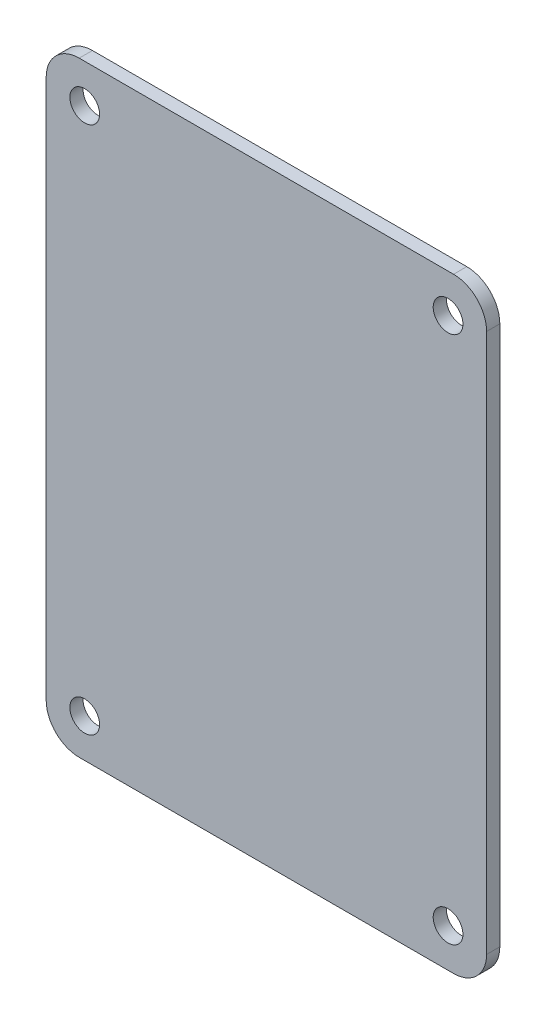
ISO-10303-21;
HEADER;
FILE_DESCRIPTION(('STEP AP214'),'2;1');
FILE_NAME('part.step','',(''),(''),'','','');
FILE_SCHEMA(('AUTOMOTIVE_DESIGN { 1 0 10303 214 1 1 1 1 }'));
ENDSEC;
DATA;
#1=APPLICATION_CONTEXT('core data for automotive mechanical design processes');
#2=APPLICATION_PROTOCOL_DEFINITION('international standard','automotive_design',2000,#1);
#3=PRODUCT_CONTEXT('',#1,'mechanical');
#4=PRODUCT('Part','Part','',(#3));
#5=PRODUCT_RELATED_PRODUCT_CATEGORY('part','',(#4));
#6=PRODUCT_DEFINITION_FORMATION('','',#4);
#7=PRODUCT_DEFINITION_CONTEXT('part definition',#1,'design');
#8=PRODUCT_DEFINITION('design','',#6,#7);
#9=PRODUCT_DEFINITION_SHAPE('','',#8);
#10=(LENGTH_UNIT() NAMED_UNIT(*) SI_UNIT(.MILLI.,.METRE.));
#11=(NAMED_UNIT(*) PLANE_ANGLE_UNIT() SI_UNIT($,.RADIAN.));
#12=(NAMED_UNIT(*) SI_UNIT($,.STERADIAN.) SOLID_ANGLE_UNIT());
#13=UNCERTAINTY_MEASURE_WITH_UNIT(LENGTH_MEASURE(1.E-05),#10,'distance_accuracy_value','');
#14=(GEOMETRIC_REPRESENTATION_CONTEXT(3) GLOBAL_UNCERTAINTY_ASSIGNED_CONTEXT((#13)) GLOBAL_UNIT_ASSIGNED_CONTEXT((#10,
#11,#12)) REPRESENTATION_CONTEXT('',''));
#15=CARTESIAN_POINT('',(0.,0.,0.));
#16=DIRECTION('',(0.,0.,1.));
#17=DIRECTION('',(1.,0.,0.));
#18=AXIS2_PLACEMENT_3D('',#15,#16,#17);
#19=CARTESIAN_POINT('',(-17.,-24.5,0.6));
#20=DIRECTION('',(0.,0.,1.));
#21=DIRECTION('',(1.,0.,0.));
#22=AXIS2_PLACEMENT_3D('',#19,#20,#21);
#23=PLANE('',#22);
#24=CARTESIAN_POINT('',(16.5,-24.,0.6));
#25=DIRECTION('',(0.,0.,1.));
#26=DIRECTION('',(1.,0.,0.));
#27=AXIS2_PLACEMENT_3D('',#24,#25,#26);
#28=CIRCLE('',#27,1.35);
#29=CARTESIAN_POINT('',(17.85,-24.,0.6));
#30=VERTEX_POINT('',#29);
#31=EDGE_CURVE('E193',#30,#30,#28,.T.);
#32=ORIENTED_EDGE('',*,*,#31,.F.);
#33=EDGE_LOOP('',(#32));
#34=FACE_BOUND('',#33,.T.);
#35=CARTESIAN_POINT('',(-16.5,24.,0.6));
#36=DIRECTION('',(0.,0.,1.));
#37=DIRECTION('',(1.,0.,0.));
#38=AXIS2_PLACEMENT_3D('',#35,#36,#37);
#39=CIRCLE('',#38,1.35);
#40=CARTESIAN_POINT('',(-15.15,24.,0.6));
#41=VERTEX_POINT('',#40);
#42=EDGE_CURVE('E139',#41,#41,#39,.T.);
#43=ORIENTED_EDGE('',*,*,#42,.F.);
#44=EDGE_LOOP('',(#43));
#45=FACE_BOUND('',#44,.T.);
#46=CARTESIAN_POINT('',(-17.,-24.5,0.6));
#47=DIRECTION('',(0.,0.,1.));
#48=DIRECTION('',(1.,0.,0.));
#49=AXIS2_PLACEMENT_3D('',#46,#47,#48);
#50=CIRCLE('',#49,3.);
#51=CARTESIAN_POINT('',(-20.,-24.5,0.6));
#52=VERTEX_POINT('',#51);
#53=CARTESIAN_POINT('',(-17.,-27.5,0.6));
#54=VERTEX_POINT('',#53);
#55=EDGE_CURVE('E150',#52,#54,#50,.T.);
#56=ORIENTED_EDGE('',*,*,#55,.T.);
#57=DIRECTION('',(1.,0.,0.));
#58=VECTOR('',#57,1.);
#59=CARTESIAN_POINT('',(-17.,-27.5,0.6));
#60=LINE('',#59,#58);
#61=CARTESIAN_POINT('',(17.,-27.5,0.6));
#62=VERTEX_POINT('',#61);
#63=EDGE_CURVE('E98',#54,#62,#60,.T.);
#64=ORIENTED_EDGE('',*,*,#63,.T.);
#65=CARTESIAN_POINT('',(17.,-24.5,0.6));
#66=DIRECTION('',(0.,0.,1.));
#67=DIRECTION('',(1.,0.,0.));
#68=AXIS2_PLACEMENT_3D('',#65,#66,#67);
#69=CIRCLE('',#68,3.);
#70=CARTESIAN_POINT('',(20.,-24.5,0.6));
#71=VERTEX_POINT('',#70);
#72=EDGE_CURVE('E165',#62,#71,#69,.T.);
#73=ORIENTED_EDGE('',*,*,#72,.T.);
#74=DIRECTION('',(0.,1.,0.));
#75=VECTOR('',#74,1.);
#76=CARTESIAN_POINT('',(20.,-24.5,0.6));
#77=LINE('',#76,#75);
#78=CARTESIAN_POINT('',(20.,24.5,0.6));
#79=VERTEX_POINT('',#78);
#80=EDGE_CURVE('E178',#71,#79,#77,.T.);
#81=ORIENTED_EDGE('',*,*,#80,.T.);
#82=CARTESIAN_POINT('',(17.,24.5,0.6));
#83=DIRECTION('',(0.,0.,1.));
#84=DIRECTION('',(-1.,0.,0.));
#85=AXIS2_PLACEMENT_3D('',#82,#83,#84);
#86=CIRCLE('',#85,3.);
#87=CARTESIAN_POINT('',(17.,27.5,0.6));
#88=VERTEX_POINT('',#87);
#89=EDGE_CURVE('E117',#79,#88,#86,.T.);
#90=ORIENTED_EDGE('',*,*,#89,.T.);
#91=DIRECTION('',(-1.,0.,0.));
#92=VECTOR('',#91,1.);
#93=CARTESIAN_POINT('',(-17.,27.5,0.6));
#94=LINE('',#93,#92);
#95=CARTESIAN_POINT('',(-17.,27.5,0.6));
#96=VERTEX_POINT('',#95);
#97=EDGE_CURVE('E111',#88,#96,#94,.T.);
#98=ORIENTED_EDGE('',*,*,#97,.T.);
#99=CARTESIAN_POINT('',(-17.,24.5,0.6));
#100=DIRECTION('',(0.,0.,1.));
#101=DIRECTION('',(-1.,0.,0.));
#102=AXIS2_PLACEMENT_3D('',#99,#100,#101);
#103=CIRCLE('',#102,3.);
#104=CARTESIAN_POINT('',(-20.,24.5,0.6));
#105=VERTEX_POINT('',#104);
#106=EDGE_CURVE('E115',#96,#105,#103,.T.);
#107=ORIENTED_EDGE('',*,*,#106,.T.);
#108=DIRECTION('',(0.,-1.,0.));
#109=VECTOR('',#108,1.);
#110=CARTESIAN_POINT('',(-20.,-24.5,0.6));
#111=LINE('',#110,#109);
#112=EDGE_CURVE('E55',#105,#52,#111,.T.);
#113=ORIENTED_EDGE('',*,*,#112,.T.);
#114=EDGE_LOOP('',(#56,#64,#73,#81,#90,#98,#107,#113));
#115=FACE_BOUND('',#114,.T.);
#116=CARTESIAN_POINT('',(-16.5,-24.,0.6));
#117=DIRECTION('',(0.,0.,1.));
#118=DIRECTION('',(1.,0.,0.));
#119=AXIS2_PLACEMENT_3D('',#116,#117,#118);
#120=CIRCLE('',#119,1.35);
#121=CARTESIAN_POINT('',(-15.15,-24.,0.6));
#122=VERTEX_POINT('',#121);
#123=EDGE_CURVE('E187',#122,#122,#120,.T.);
#124=ORIENTED_EDGE('',*,*,#123,.F.);
#125=EDGE_LOOP('',(#124));
#126=FACE_BOUND('',#125,.T.);
#127=CARTESIAN_POINT('',(16.5,24.,0.6));
#128=DIRECTION('',(0.,0.,1.));
#129=DIRECTION('',(1.,0.,0.));
#130=AXIS2_PLACEMENT_3D('',#127,#128,#129);
#131=CIRCLE('',#130,1.35);
#132=CARTESIAN_POINT('',(17.85,24.,0.6));
#133=VERTEX_POINT('',#132);
#134=EDGE_CURVE('E199',#133,#133,#131,.T.);
#135=ORIENTED_EDGE('',*,*,#134,.F.);
#136=EDGE_LOOP('',(#135));
#137=FACE_BOUND('',#136,.T.);
#138=ADVANCED_FACE('F38',(#34,#45,#115,#126,#137),#23,.T.);
#139=CARTESIAN_POINT('',(-17.,-24.5,-0.6));
#140=DIRECTION('',(0.,0.,1.));
#141=DIRECTION('',(1.,0.,0.));
#142=AXIS2_PLACEMENT_3D('',#139,#140,#141);
#143=PLANE('',#142);
#144=CARTESIAN_POINT('',(-17.,-24.5,-0.6));
#145=DIRECTION('',(0.,0.,1.));
#146=DIRECTION('',(1.,0.,0.));
#147=AXIS2_PLACEMENT_3D('',#144,#145,#146);
#148=CIRCLE('',#147,3.);
#149=CARTESIAN_POINT('',(-20.,-24.5,-0.6));
#150=VERTEX_POINT('',#149);
#151=CARTESIAN_POINT('',(-17.,-27.5,-0.6));
#152=VERTEX_POINT('',#151);
#153=EDGE_CURVE('E135',#150,#152,#148,.T.);
#154=ORIENTED_EDGE('',*,*,#153,.F.);
#155=DIRECTION('',(0.,-1.,0.));
#156=VECTOR('',#155,1.);
#157=CARTESIAN_POINT('',(-20.,-24.5,-0.6));
#158=LINE('',#157,#156);
#159=CARTESIAN_POINT('',(-20.,24.5,-0.6));
#160=VERTEX_POINT('',#159);
#161=EDGE_CURVE('E90',#160,#150,#158,.T.);
#162=ORIENTED_EDGE('',*,*,#161,.F.);
#163=CARTESIAN_POINT('',(-17.,24.5,-0.6));
#164=DIRECTION('',(0.,0.,1.));
#165=DIRECTION('',(-1.,0.,0.));
#166=AXIS2_PLACEMENT_3D('',#163,#164,#165);
#167=CIRCLE('',#166,3.);
#168=CARTESIAN_POINT('',(-17.,27.5,-0.6));
#169=VERTEX_POINT('',#168);
#170=EDGE_CURVE('E84',#169,#160,#167,.T.);
#171=ORIENTED_EDGE('',*,*,#170,.F.);
#172=DIRECTION('',(-1.,0.,0.));
#173=VECTOR('',#172,1.);
#174=CARTESIAN_POINT('',(-17.,27.5,-0.6));
#175=LINE('',#174,#173);
#176=CARTESIAN_POINT('',(17.,27.5,-0.6));
#177=VERTEX_POINT('',#176);
#178=EDGE_CURVE('E125',#177,#169,#175,.T.);
#179=ORIENTED_EDGE('',*,*,#178,.F.);
#180=CARTESIAN_POINT('',(17.,24.5,-0.6));
#181=DIRECTION('',(0.,0.,1.));
#182=DIRECTION('',(-1.,0.,0.));
#183=AXIS2_PLACEMENT_3D('',#180,#181,#182);
#184=CIRCLE('',#183,3.);
#185=CARTESIAN_POINT('',(20.,24.5,-0.6));
#186=VERTEX_POINT('',#185);
#187=EDGE_CURVE('E145',#186,#177,#184,.T.);
#188=ORIENTED_EDGE('',*,*,#187,.F.);
#189=DIRECTION('',(0.,1.,0.));
#190=VECTOR('',#189,1.);
#191=CARTESIAN_POINT('',(20.,-24.5,-0.6));
#192=LINE('',#191,#190);
#193=CARTESIAN_POINT('',(20.,-24.5,-0.6));
#194=VERTEX_POINT('',#193);
#195=EDGE_CURVE('E143',#194,#186,#192,.T.);
#196=ORIENTED_EDGE('',*,*,#195,.F.);
#197=CARTESIAN_POINT('',(17.,-24.5,-0.6));
#198=DIRECTION('',(0.,0.,1.));
#199=DIRECTION('',(1.,0.,0.));
#200=AXIS2_PLACEMENT_3D('',#197,#198,#199);
#201=CIRCLE('',#200,3.);
#202=CARTESIAN_POINT('',(17.,-27.5,-0.6));
#203=VERTEX_POINT('',#202);
#204=EDGE_CURVE('E141',#203,#194,#201,.T.);
#205=ORIENTED_EDGE('',*,*,#204,.F.);
#206=DIRECTION('',(1.,0.,0.));
#207=VECTOR('',#206,1.);
#208=CARTESIAN_POINT('',(-17.,-27.5,-0.6));
#209=LINE('',#208,#207);
#210=EDGE_CURVE('E138',#152,#203,#209,.T.);
#211=ORIENTED_EDGE('',*,*,#210,.F.);
#212=EDGE_LOOP('',(#154,#162,#171,#179,#188,#196,#205,#211));
#213=FACE_BOUND('',#212,.T.);
#214=CARTESIAN_POINT('',(-16.5,24.,-0.6));
#215=DIRECTION('',(0.,0.,1.));
#216=DIRECTION('',(1.,0.,0.));
#217=AXIS2_PLACEMENT_3D('',#214,#215,#216);
#218=CIRCLE('',#217,1.35);
#219=CARTESIAN_POINT('',(-15.15,24.,-0.6));
#220=VERTEX_POINT('',#219);
#221=EDGE_CURVE('E184',#220,#220,#218,.T.);
#222=ORIENTED_EDGE('',*,*,#221,.T.);
#223=EDGE_LOOP('',(#222));
#224=FACE_BOUND('',#223,.T.);
#225=CARTESIAN_POINT('',(-16.5,-24.,-0.6));
#226=DIRECTION('',(0.,0.,1.));
#227=DIRECTION('',(1.,0.,0.));
#228=AXIS2_PLACEMENT_3D('',#225,#226,#227);
#229=CIRCLE('',#228,1.35);
#230=CARTESIAN_POINT('',(-15.15,-24.,-0.6));
#231=VERTEX_POINT('',#230);
#232=EDGE_CURVE('E190',#231,#231,#229,.T.);
#233=ORIENTED_EDGE('',*,*,#232,.T.);
#234=EDGE_LOOP('',(#233));
#235=FACE_BOUND('',#234,.T.);
#236=CARTESIAN_POINT('',(16.5,-24.,-0.6));
#237=DIRECTION('',(0.,0.,1.));
#238=DIRECTION('',(1.,0.,0.));
#239=AXIS2_PLACEMENT_3D('',#236,#237,#238);
#240=CIRCLE('',#239,1.35);
#241=CARTESIAN_POINT('',(17.85,-24.,-0.6));
#242=VERTEX_POINT('',#241);
#243=EDGE_CURVE('E196',#242,#242,#240,.T.);
#244=ORIENTED_EDGE('',*,*,#243,.T.);
#245=EDGE_LOOP('',(#244));
#246=FACE_BOUND('',#245,.T.);
#247=CARTESIAN_POINT('',(16.5,24.,-0.6));
#248=DIRECTION('',(0.,0.,1.));
#249=DIRECTION('',(1.,0.,0.));
#250=AXIS2_PLACEMENT_3D('',#247,#248,#249);
#251=CIRCLE('',#250,1.35);
#252=CARTESIAN_POINT('',(17.85,24.,-0.6));
#253=VERTEX_POINT('',#252);
#254=EDGE_CURVE('E202',#253,#253,#251,.T.);
#255=ORIENTED_EDGE('',*,*,#254,.T.);
#256=EDGE_LOOP('',(#255));
#257=FACE_BOUND('',#256,.T.);
#258=ADVANCED_FACE('F169',(#213,#224,#235,#246,#257),#143,.F.);
#259=CARTESIAN_POINT('',(-17.,-24.5,0.6));
#260=DIRECTION('',(0.,0.,-1.));
#261=DIRECTION('',(-1.,0.,0.));
#262=AXIS2_PLACEMENT_3D('',#259,#260,#261);
#263=CYLINDRICAL_SURFACE('',#262,3.);
#264=ORIENTED_EDGE('',*,*,#153,.T.);
#265=DIRECTION('',(0.,0.,-1.));
#266=VECTOR('',#265,1.);
#267=CARTESIAN_POINT('',(-17.,-27.5,0.6));
#268=LINE('',#267,#266);
#269=EDGE_CURVE('E11',#54,#152,#268,.T.);
#270=ORIENTED_EDGE('',*,*,#269,.F.);
#271=ORIENTED_EDGE('',*,*,#55,.F.);
#272=DIRECTION('',(0.,0.,-1.));
#273=VECTOR('',#272,1.);
#274=CARTESIAN_POINT('',(-20.,-24.5,0.6));
#275=LINE('',#274,#273);
#276=EDGE_CURVE('E131',#52,#150,#275,.T.);
#277=ORIENTED_EDGE('',*,*,#276,.T.);
#278=EDGE_LOOP('',(#264,#270,#271,#277));
#279=FACE_BOUND('',#278,.T.);
#280=ADVANCED_FACE('F40',(#279),#263,.T.);
#281=CARTESIAN_POINT('',(-17.,-27.5,0.6));
#282=DIRECTION('',(0.,1.,0.));
#283=DIRECTION('',(0.,0.,1.));
#284=AXIS2_PLACEMENT_3D('',#281,#282,#283);
#285=PLANE('',#284);
#286=ORIENTED_EDGE('',*,*,#210,.T.);
#287=DIRECTION('',(0.,0.,-1.));
#288=VECTOR('',#287,1.);
#289=CARTESIAN_POINT('',(17.,-27.5,0.6));
#290=LINE('',#289,#288);
#291=EDGE_CURVE('E47',#62,#203,#290,.T.);
#292=ORIENTED_EDGE('',*,*,#291,.F.);
#293=ORIENTED_EDGE('',*,*,#63,.F.);
#294=ORIENTED_EDGE('',*,*,#269,.T.);
#295=EDGE_LOOP('',(#286,#292,#293,#294));
#296=FACE_BOUND('',#295,.T.);
#297=ADVANCED_FACE('F236',(#296),#285,.F.);
#298=CARTESIAN_POINT('',(17.,-24.5,0.6));
#299=DIRECTION('',(0.,0.,-1.));
#300=DIRECTION('',(-1.,0.,0.));
#301=AXIS2_PLACEMENT_3D('',#298,#299,#300);
#302=CYLINDRICAL_SURFACE('',#301,3.);
#303=ORIENTED_EDGE('',*,*,#204,.T.);
#304=DIRECTION('',(0.,0.,-1.));
#305=VECTOR('',#304,1.);
#306=CARTESIAN_POINT('',(20.,-24.5,0.6));
#307=LINE('',#306,#305);
#308=EDGE_CURVE('E157',#71,#194,#307,.T.);
#309=ORIENTED_EDGE('',*,*,#308,.F.);
#310=ORIENTED_EDGE('',*,*,#72,.F.);
#311=ORIENTED_EDGE('',*,*,#291,.T.);
#312=EDGE_LOOP('',(#303,#309,#310,#311));
#313=FACE_BOUND('',#312,.T.);
#314=ADVANCED_FACE('F163',(#313),#302,.T.);
#315=CARTESIAN_POINT('',(20.,-24.5,0.6));
#316=DIRECTION('',(-1.,0.,0.));
#317=DIRECTION('',(0.,0.,1.));
#318=AXIS2_PLACEMENT_3D('',#315,#316,#317);
#319=PLANE('',#318);
#320=ORIENTED_EDGE('',*,*,#195,.T.);
#321=DIRECTION('',(0.,0.,-1.));
#322=VECTOR('',#321,1.);
#323=CARTESIAN_POINT('',(20.,24.5,0.6));
#324=LINE('',#323,#322);
#325=EDGE_CURVE('E154',#79,#186,#324,.T.);
#326=ORIENTED_EDGE('',*,*,#325,.F.);
#327=ORIENTED_EDGE('',*,*,#80,.F.);
#328=ORIENTED_EDGE('',*,*,#308,.T.);
#329=EDGE_LOOP('',(#320,#326,#327,#328));
#330=FACE_BOUND('',#329,.T.);
#331=ADVANCED_FACE('F174',(#330),#319,.F.);
#332=CARTESIAN_POINT('',(17.,24.5,0.6));
#333=DIRECTION('',(0.,0.,-1.));
#334=DIRECTION('',(-1.,0.,0.));
#335=AXIS2_PLACEMENT_3D('',#332,#333,#334);
#336=CYLINDRICAL_SURFACE('',#335,3.);
#337=ORIENTED_EDGE('',*,*,#187,.T.);
#338=DIRECTION('',(0.,0.,-1.));
#339=VECTOR('',#338,1.);
#340=CARTESIAN_POINT('',(17.,27.5,0.6));
#341=LINE('',#340,#339);
#342=EDGE_CURVE('E126',#88,#177,#341,.T.);
#343=ORIENTED_EDGE('',*,*,#342,.F.);
#344=ORIENTED_EDGE('',*,*,#89,.F.);
#345=ORIENTED_EDGE('',*,*,#325,.T.);
#346=EDGE_LOOP('',(#337,#343,#344,#345));
#347=FACE_BOUND('',#346,.T.);
#348=ADVANCED_FACE('F177',(#347),#336,.T.);
#349=CARTESIAN_POINT('',(-17.,27.5,0.6));
#350=DIRECTION('',(0.,-1.,0.));
#351=DIRECTION('',(0.,0.,-1.));
#352=AXIS2_PLACEMENT_3D('',#349,#350,#351);
#353=PLANE('',#352);
#354=ORIENTED_EDGE('',*,*,#178,.T.);
#355=DIRECTION('',(0.,0.,-1.));
#356=VECTOR('',#355,1.);
#357=CARTESIAN_POINT('',(-17.,27.5,0.6));
#358=LINE('',#357,#356);
#359=EDGE_CURVE('E122',#96,#169,#358,.T.);
#360=ORIENTED_EDGE('',*,*,#359,.F.);
#361=ORIENTED_EDGE('',*,*,#97,.F.);
#362=ORIENTED_EDGE('',*,*,#342,.T.);
#363=EDGE_LOOP('',(#354,#360,#361,#362));
#364=FACE_BOUND('',#363,.T.);
#365=ADVANCED_FACE('F123',(#364),#353,.F.);
#366=CARTESIAN_POINT('',(-17.,24.5,0.6));
#367=DIRECTION('',(0.,0.,-1.));
#368=DIRECTION('',(-1.,0.,0.));
#369=AXIS2_PLACEMENT_3D('',#366,#367,#368);
#370=CYLINDRICAL_SURFACE('',#369,3.);
#371=ORIENTED_EDGE('',*,*,#170,.T.);
#372=DIRECTION('',(0.,0.,-1.));
#373=VECTOR('',#372,1.);
#374=CARTESIAN_POINT('',(-20.,24.5,0.6));
#375=LINE('',#374,#373);
#376=EDGE_CURVE('E127',#105,#160,#375,.T.);
#377=ORIENTED_EDGE('',*,*,#376,.F.);
#378=ORIENTED_EDGE('',*,*,#106,.F.);
#379=ORIENTED_EDGE('',*,*,#359,.T.);
#380=EDGE_LOOP('',(#371,#377,#378,#379));
#381=FACE_BOUND('',#380,.T.);
#382=ADVANCED_FACE('F129',(#381),#370,.T.);
#383=CARTESIAN_POINT('',(-20.,-24.5,0.6));
#384=DIRECTION('',(1.,0.,0.));
#385=DIRECTION('',(0.,0.,-1.));
#386=AXIS2_PLACEMENT_3D('',#383,#384,#385);
#387=PLANE('',#386);
#388=ORIENTED_EDGE('',*,*,#161,.T.);
#389=ORIENTED_EDGE('',*,*,#276,.F.);
#390=ORIENTED_EDGE('',*,*,#112,.F.);
#391=ORIENTED_EDGE('',*,*,#376,.T.);
#392=EDGE_LOOP('',(#388,#389,#390,#391));
#393=FACE_BOUND('',#392,.T.);
#394=ADVANCED_FACE('F224',(#393),#387,.F.);
#395=CARTESIAN_POINT('',(-16.5,24.,0.6));
#396=DIRECTION('',(0.,0.,-1.));
#397=DIRECTION('',(-1.,0.,0.));
#398=AXIS2_PLACEMENT_3D('',#395,#396,#397);
#399=CYLINDRICAL_SURFACE('',#398,1.35);
#400=ORIENTED_EDGE('',*,*,#42,.T.);
#401=EDGE_LOOP('',(#400));
#402=FACE_BOUND('',#401,.T.);
#403=ORIENTED_EDGE('',*,*,#221,.F.);
#404=EDGE_LOOP('',(#403));
#405=FACE_BOUND('',#404,.T.);
#406=ADVANCED_FACE('F221',(#402,#405),#399,.F.);
#407=CARTESIAN_POINT('',(-16.5,-24.,0.6));
#408=DIRECTION('',(0.,0.,-1.));
#409=DIRECTION('',(-1.,0.,0.));
#410=AXIS2_PLACEMENT_3D('',#407,#408,#409);
#411=CYLINDRICAL_SURFACE('',#410,1.35);
#412=ORIENTED_EDGE('',*,*,#123,.T.);
#413=EDGE_LOOP('',(#412));
#414=FACE_BOUND('',#413,.T.);
#415=ORIENTED_EDGE('',*,*,#232,.F.);
#416=EDGE_LOOP('',(#415));
#417=FACE_BOUND('',#416,.T.);
#418=ADVANCED_FACE('F300',(#414,#417),#411,.F.);
#419=CARTESIAN_POINT('',(16.5,-24.,0.6));
#420=DIRECTION('',(0.,0.,-1.));
#421=DIRECTION('',(-1.,0.,0.));
#422=AXIS2_PLACEMENT_3D('',#419,#420,#421);
#423=CYLINDRICAL_SURFACE('',#422,1.35);
#424=ORIENTED_EDGE('',*,*,#31,.T.);
#425=EDGE_LOOP('',(#424));
#426=FACE_BOUND('',#425,.T.);
#427=ORIENTED_EDGE('',*,*,#243,.F.);
#428=EDGE_LOOP('',(#427));
#429=FACE_BOUND('',#428,.T.);
#430=ADVANCED_FACE('F308',(#426,#429),#423,.F.);
#431=CARTESIAN_POINT('',(16.5,24.,0.6));
#432=DIRECTION('',(0.,0.,-1.));
#433=DIRECTION('',(-1.,0.,0.));
#434=AXIS2_PLACEMENT_3D('',#431,#432,#433);
#435=CYLINDRICAL_SURFACE('',#434,1.35);
#436=ORIENTED_EDGE('',*,*,#134,.T.);
#437=EDGE_LOOP('',(#436));
#438=FACE_BOUND('',#437,.T.);
#439=ORIENTED_EDGE('',*,*,#254,.F.);
#440=EDGE_LOOP('',(#439));
#441=FACE_BOUND('',#440,.T.);
#442=ADVANCED_FACE('F208',(#438,#441),#435,.F.);
#443=CLOSED_SHELL('',(#138,#258,#280,#297,#314,#331,#348,#365,#382,#394,#406,#418,#430,#442));
#444=MANIFOLD_SOLID_BREP('B2',#443);
#445=ADVANCED_BREP_SHAPE_REPRESENTATION('',(#18,#444),#14);
#446=SHAPE_DEFINITION_REPRESENTATION(#9,#445);
ENDSEC;
END-ISO-10303-21;
